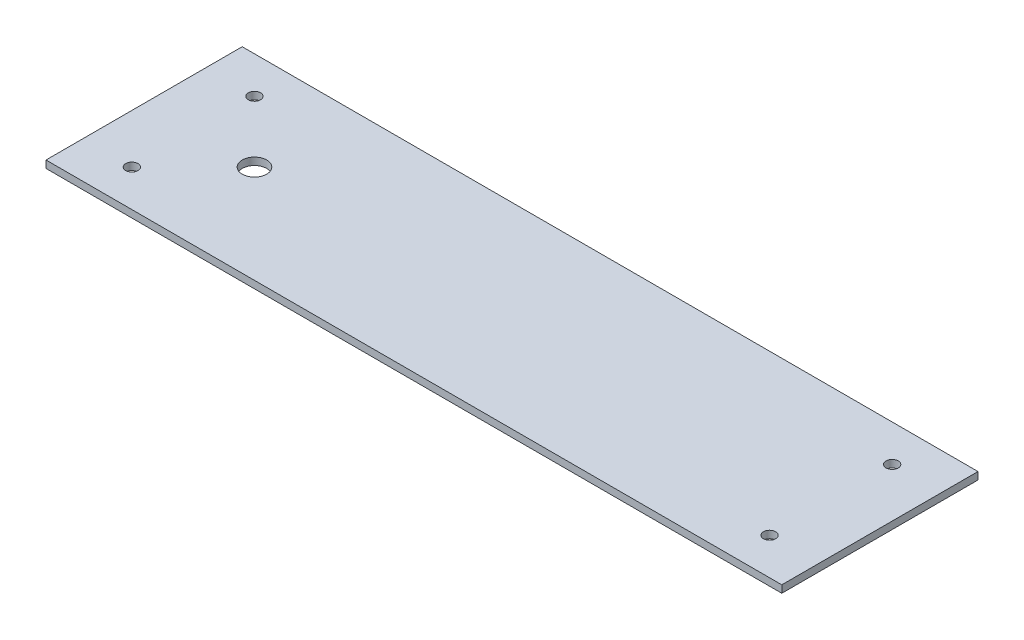
ISO-10303-21;
HEADER;
FILE_DESCRIPTION(('STEP AP214'),'2;1');
FILE_NAME('part.step','',(''),(''),'','','');
FILE_SCHEMA(('AUTOMOTIVE_DESIGN { 1 0 10303 214 1 1 1 1 }'));
ENDSEC;
DATA;
#1=APPLICATION_CONTEXT('core data for automotive mechanical design processes');
#2=APPLICATION_PROTOCOL_DEFINITION('international standard','automotive_design',2000,#1);
#3=PRODUCT_CONTEXT('',#1,'mechanical');
#4=PRODUCT('Part','Part','',(#3));
#5=PRODUCT_RELATED_PRODUCT_CATEGORY('part','',(#4));
#6=PRODUCT_DEFINITION_FORMATION('','',#4);
#7=PRODUCT_DEFINITION_CONTEXT('part definition',#1,'design');
#8=PRODUCT_DEFINITION('design','',#6,#7);
#9=PRODUCT_DEFINITION_SHAPE('','',#8);
#10=(LENGTH_UNIT() NAMED_UNIT(*) SI_UNIT(.MILLI.,.METRE.));
#11=(NAMED_UNIT(*) PLANE_ANGLE_UNIT() SI_UNIT($,.RADIAN.));
#12=(NAMED_UNIT(*) SI_UNIT($,.STERADIAN.) SOLID_ANGLE_UNIT());
#13=UNCERTAINTY_MEASURE_WITH_UNIT(LENGTH_MEASURE(1.E-05),#10,'distance_accuracy_value','');
#14=(GEOMETRIC_REPRESENTATION_CONTEXT(3) GLOBAL_UNCERTAINTY_ASSIGNED_CONTEXT((#13)) GLOBAL_UNIT_ASSIGNED_CONTEXT((#10,
#11,#12)) REPRESENTATION_CONTEXT('',''));
#15=CARTESIAN_POINT('',(0.,0.,0.));
#16=DIRECTION('',(0.,0.,1.));
#17=DIRECTION('',(1.,0.,0.));
#18=AXIS2_PLACEMENT_3D('',#15,#16,#17);
#19=CARTESIAN_POINT('',(0.,3.,0.));
#20=DIRECTION('',(0.,1.,0.));
#21=DIRECTION('',(0.,0.,1.));
#22=AXIS2_PLACEMENT_3D('',#19,#20,#21);
#23=PLANE('',#22);
#24=CARTESIAN_POINT('',(129.720603623045,3.,25.312194143202));
#25=DIRECTION('',(0.,1.,0.));
#26=DIRECTION('',(0.,0.,1.));
#27=AXIS2_PLACEMENT_3D('',#24,#25,#26);
#28=CIRCLE('',#27,2.5);
#29=CARTESIAN_POINT('',(129.720603623045,3.,27.812194143202));
#30=VERTEX_POINT('',#29);
#31=EDGE_CURVE('E127',#30,#30,#28,.T.);
#32=ORIENTED_EDGE('',*,*,#31,.F.);
#33=EDGE_LOOP('',(#32));
#34=FACE_BOUND('',#33,.T.);
#35=CARTESIAN_POINT('',(-130.279396376955,3.,25.312194143202));
#36=DIRECTION('',(0.,1.,0.));
#37=DIRECTION('',(0.,0.,1.));
#38=AXIS2_PLACEMENT_3D('',#35,#36,#37);
#39=CIRCLE('',#38,2.5);
#40=CARTESIAN_POINT('',(-130.279396376955,3.,27.812194143202));
#41=VERTEX_POINT('',#40);
#42=EDGE_CURVE('E115',#41,#41,#39,.T.);
#43=ORIENTED_EDGE('',*,*,#42,.F.);
#44=EDGE_LOOP('',(#43));
#45=FACE_BOUND('',#44,.T.);
#46=DIRECTION('',(0.,0.,1.));
#47=VECTOR('',#46,1.);
#48=CARTESIAN_POINT('',(-150.279396376955,3.,-39.687805856798));
#49=LINE('',#48,#47);
#50=CARTESIAN_POINT('',(-150.279396376955,3.,-39.687805856798));
#51=VERTEX_POINT('',#50);
#52=CARTESIAN_POINT('',(-150.279396376955,3.,40.312194143202));
#53=VERTEX_POINT('',#52);
#54=EDGE_CURVE('E85',#51,#53,#49,.T.);
#55=ORIENTED_EDGE('',*,*,#54,.T.);
#56=DIRECTION('',(1.,0.,0.));
#57=VECTOR('',#56,1.);
#58=CARTESIAN_POINT('',(-150.279396376955,3.,40.312194143202));
#59=LINE('',#58,#57);
#60=CARTESIAN_POINT('',(149.720603623045,3.,40.312194143202));
#61=VERTEX_POINT('',#60);
#62=EDGE_CURVE('E80',#53,#61,#59,.T.);
#63=ORIENTED_EDGE('',*,*,#62,.T.);
#64=DIRECTION('',(0.,0.,-1.));
#65=VECTOR('',#64,1.);
#66=CARTESIAN_POINT('',(149.720603623045,3.,-39.687805856798));
#67=LINE('',#66,#65);
#68=CARTESIAN_POINT('',(149.720603623045,3.,-39.687805856798));
#69=VERTEX_POINT('',#68);
#70=EDGE_CURVE('E83',#61,#69,#67,.T.);
#71=ORIENTED_EDGE('',*,*,#70,.T.);
#72=DIRECTION('',(-1.,0.,0.));
#73=VECTOR('',#72,1.);
#74=CARTESIAN_POINT('',(-150.279396376955,3.,-39.687805856798));
#75=LINE('',#74,#73);
#76=EDGE_CURVE('E50',#69,#51,#75,.T.);
#77=ORIENTED_EDGE('',*,*,#76,.T.);
#78=EDGE_LOOP('',(#55,#63,#71,#77));
#79=FACE_BOUND('',#78,.T.);
#80=CARTESIAN_POINT('',(-130.279396376955,3.,-24.687805856798));
#81=DIRECTION('',(0.,1.,0.));
#82=DIRECTION('',(0.,0.,1.));
#83=AXIS2_PLACEMENT_3D('',#80,#81,#82);
#84=CIRCLE('',#83,2.5);
#85=CARTESIAN_POINT('',(-130.279396376955,3.,-22.187805856798));
#86=VERTEX_POINT('',#85);
#87=EDGE_CURVE('E100',#86,#86,#84,.T.);
#88=ORIENTED_EDGE('',*,*,#87,.F.);
#89=EDGE_LOOP('',(#88));
#90=FACE_BOUND('',#89,.T.);
#91=CARTESIAN_POINT('',(129.720603623045,3.,-24.687805856798));
#92=DIRECTION('',(0.,1.,0.));
#93=DIRECTION('',(0.,0.,1.));
#94=AXIS2_PLACEMENT_3D('',#91,#92,#93);
#95=CIRCLE('',#94,2.5);
#96=CARTESIAN_POINT('',(129.720603623045,3.,-22.187805856798));
#97=VERTEX_POINT('',#96);
#98=EDGE_CURVE('E121',#97,#97,#95,.T.);
#99=ORIENTED_EDGE('',*,*,#98,.F.);
#100=EDGE_LOOP('',(#99));
#101=FACE_BOUND('',#100,.T.);
#102=CARTESIAN_POINT('',(-105.279396376955,3.,0.312194143202014));
#103=DIRECTION('',(0.,1.,0.));
#104=DIRECTION('',(0.,0.,1.));
#105=AXIS2_PLACEMENT_3D('',#102,#103,#104);
#106=CIRCLE('',#105,5.);
#107=CARTESIAN_POINT('',(-105.279396376955,3.,5.31219414320202));
#108=VERTEX_POINT('',#107);
#109=EDGE_CURVE('E133',#108,#108,#106,.T.);
#110=ORIENTED_EDGE('',*,*,#109,.F.);
#111=EDGE_LOOP('',(#110));
#112=FACE_BOUND('',#111,.T.);
#113=ADVANCED_FACE('F33',(#34,#45,#79,#90,#101,#112),#23,.T.);
#114=CARTESIAN_POINT('',(0.,0.,0.));
#115=DIRECTION('',(0.,1.,0.));
#116=DIRECTION('',(0.,0.,1.));
#117=AXIS2_PLACEMENT_3D('',#114,#115,#116);
#118=PLANE('',#117);
#119=CARTESIAN_POINT('',(129.720603623045,0.,25.312194143202));
#120=DIRECTION('',(0.,1.,0.));
#121=DIRECTION('',(0.,0.,1.));
#122=AXIS2_PLACEMENT_3D('',#119,#120,#121);
#123=CIRCLE('',#122,2.5);
#124=CARTESIAN_POINT('',(129.720603623045,0.,27.812194143202));
#125=VERTEX_POINT('',#124);
#126=EDGE_CURVE('E130',#125,#125,#123,.T.);
#127=ORIENTED_EDGE('',*,*,#126,.T.);
#128=EDGE_LOOP('',(#127));
#129=FACE_BOUND('',#128,.T.);
#130=CARTESIAN_POINT('',(-130.279396376955,0.,25.312194143202));
#131=DIRECTION('',(0.,1.,0.));
#132=DIRECTION('',(0.,0.,1.));
#133=AXIS2_PLACEMENT_3D('',#130,#131,#132);
#134=CIRCLE('',#133,2.5);
#135=CARTESIAN_POINT('',(-130.279396376955,0.,27.812194143202));
#136=VERTEX_POINT('',#135);
#137=EDGE_CURVE('E118',#136,#136,#134,.T.);
#138=ORIENTED_EDGE('',*,*,#137,.T.);
#139=EDGE_LOOP('',(#138));
#140=FACE_BOUND('',#139,.T.);
#141=DIRECTION('',(0.,0.,1.));
#142=VECTOR('',#141,1.);
#143=CARTESIAN_POINT('',(-150.279396376955,0.,-39.687805856798));
#144=LINE('',#143,#142);
#145=CARTESIAN_POINT('',(-150.279396376955,0.,-39.687805856798));
#146=VERTEX_POINT('',#145);
#147=CARTESIAN_POINT('',(-150.279396376955,0.,40.312194143202));
#148=VERTEX_POINT('',#147);
#149=EDGE_CURVE('E97',#146,#148,#144,.T.);
#150=ORIENTED_EDGE('',*,*,#149,.F.);
#151=DIRECTION('',(-1.,0.,0.));
#152=VECTOR('',#151,1.);
#153=CARTESIAN_POINT('',(-150.279396376955,0.,-39.687805856798));
#154=LINE('',#153,#152);
#155=CARTESIAN_POINT('',(149.720603623045,0.,-39.687805856798));
#156=VERTEX_POINT('',#155);
#157=EDGE_CURVE('E73',#156,#146,#154,.T.);
#158=ORIENTED_EDGE('',*,*,#157,.F.);
#159=DIRECTION('',(0.,0.,-1.));
#160=VECTOR('',#159,1.);
#161=CARTESIAN_POINT('',(149.720603623045,0.,-39.687805856798));
#162=LINE('',#161,#160);
#163=CARTESIAN_POINT('',(149.720603623045,0.,40.312194143202));
#164=VERTEX_POINT('',#163);
#165=EDGE_CURVE('E67',#164,#156,#162,.T.);
#166=ORIENTED_EDGE('',*,*,#165,.F.);
#167=DIRECTION('',(1.,0.,0.));
#168=VECTOR('',#167,1.);
#169=CARTESIAN_POINT('',(-150.279396376955,0.,40.312194143202));
#170=LINE('',#169,#168);
#171=EDGE_CURVE('E89',#148,#164,#170,.T.);
#172=ORIENTED_EDGE('',*,*,#171,.F.);
#173=EDGE_LOOP('',(#150,#158,#166,#172));
#174=FACE_BOUND('',#173,.T.);
#175=CARTESIAN_POINT('',(-130.279396376955,0.,-24.687805856798));
#176=DIRECTION('',(0.,1.,0.));
#177=DIRECTION('',(0.,0.,1.));
#178=AXIS2_PLACEMENT_3D('',#175,#176,#177);
#179=CIRCLE('',#178,2.5);
#180=CARTESIAN_POINT('',(-130.279396376955,0.,-22.187805856798));
#181=VERTEX_POINT('',#180);
#182=EDGE_CURVE('E112',#181,#181,#179,.T.);
#183=ORIENTED_EDGE('',*,*,#182,.T.);
#184=EDGE_LOOP('',(#183));
#185=FACE_BOUND('',#184,.T.);
#186=CARTESIAN_POINT('',(129.720603623045,0.,-24.687805856798));
#187=DIRECTION('',(0.,1.,0.));
#188=DIRECTION('',(0.,0.,1.));
#189=AXIS2_PLACEMENT_3D('',#186,#187,#188);
#190=CIRCLE('',#189,2.5);
#191=CARTESIAN_POINT('',(129.720603623045,0.,-22.187805856798));
#192=VERTEX_POINT('',#191);
#193=EDGE_CURVE('E124',#192,#192,#190,.T.);
#194=ORIENTED_EDGE('',*,*,#193,.T.);
#195=EDGE_LOOP('',(#194));
#196=FACE_BOUND('',#195,.T.);
#197=CARTESIAN_POINT('',(-105.279396376955,0.,0.312194143202014));
#198=DIRECTION('',(0.,1.,0.));
#199=DIRECTION('',(0.,0.,1.));
#200=AXIS2_PLACEMENT_3D('',#197,#198,#199);
#201=CIRCLE('',#200,5.);
#202=CARTESIAN_POINT('',(-105.279396376955,0.,5.31219414320202));
#203=VERTEX_POINT('',#202);
#204=EDGE_CURVE('E136',#203,#203,#201,.T.);
#205=ORIENTED_EDGE('',*,*,#204,.T.);
#206=EDGE_LOOP('',(#205));
#207=FACE_BOUND('',#206,.T.);
#208=ADVANCED_FACE('F108',(#129,#140,#174,#185,#196,#207),#118,.F.);
#209=CARTESIAN_POINT('',(-150.279396376955,3.,-39.687805856798));
#210=DIRECTION('',(1.,0.,0.));
#211=DIRECTION('',(0.,0.,-1.));
#212=AXIS2_PLACEMENT_3D('',#209,#210,#211);
#213=PLANE('',#212);
#214=ORIENTED_EDGE('',*,*,#149,.T.);
#215=DIRECTION('',(0.,-1.,0.));
#216=VECTOR('',#215,1.);
#217=CARTESIAN_POINT('',(-150.279396376955,3.,40.312194143202));
#218=LINE('',#217,#216);
#219=EDGE_CURVE('E11',#53,#148,#218,.T.);
#220=ORIENTED_EDGE('',*,*,#219,.F.);
#221=ORIENTED_EDGE('',*,*,#54,.F.);
#222=DIRECTION('',(0.,-1.,0.));
#223=VECTOR('',#222,1.);
#224=CARTESIAN_POINT('',(-150.279396376955,3.,-39.687805856798));
#225=LINE('',#224,#223);
#226=EDGE_CURVE('E93',#51,#146,#225,.T.);
#227=ORIENTED_EDGE('',*,*,#226,.T.);
#228=EDGE_LOOP('',(#214,#220,#221,#227));
#229=FACE_BOUND('',#228,.T.);
#230=ADVANCED_FACE('F35',(#229),#213,.F.);
#231=CARTESIAN_POINT('',(-150.279396376955,3.,40.312194143202));
#232=DIRECTION('',(0.,0.,-1.));
#233=DIRECTION('',(-1.,0.,0.));
#234=AXIS2_PLACEMENT_3D('',#231,#232,#233);
#235=PLANE('',#234);
#236=ORIENTED_EDGE('',*,*,#171,.T.);
#237=DIRECTION('',(0.,-1.,0.));
#238=VECTOR('',#237,1.);
#239=CARTESIAN_POINT('',(149.720603623045,3.,40.312194143202));
#240=LINE('',#239,#238);
#241=EDGE_CURVE('E42',#61,#164,#240,.T.);
#242=ORIENTED_EDGE('',*,*,#241,.F.);
#243=ORIENTED_EDGE('',*,*,#62,.F.);
#244=ORIENTED_EDGE('',*,*,#219,.T.);
#245=EDGE_LOOP('',(#236,#242,#243,#244));
#246=FACE_BOUND('',#245,.T.);
#247=ADVANCED_FACE('F88',(#246),#235,.F.);
#248=CARTESIAN_POINT('',(149.720603623045,3.,-39.687805856798));
#249=DIRECTION('',(-1.,0.,0.));
#250=DIRECTION('',(0.,0.,1.));
#251=AXIS2_PLACEMENT_3D('',#248,#249,#250);
#252=PLANE('',#251);
#253=ORIENTED_EDGE('',*,*,#165,.T.);
#254=DIRECTION('',(0.,-1.,0.));
#255=VECTOR('',#254,1.);
#256=CARTESIAN_POINT('',(149.720603623045,3.,-39.687805856798));
#257=LINE('',#256,#255);
#258=EDGE_CURVE('E90',#69,#156,#257,.T.);
#259=ORIENTED_EDGE('',*,*,#258,.F.);
#260=ORIENTED_EDGE('',*,*,#70,.F.);
#261=ORIENTED_EDGE('',*,*,#241,.T.);
#262=EDGE_LOOP('',(#253,#259,#260,#261));
#263=FACE_BOUND('',#262,.T.);
#264=ADVANCED_FACE('F91',(#263),#252,.F.);
#265=CARTESIAN_POINT('',(-150.279396376955,3.,-39.687805856798));
#266=DIRECTION('',(0.,0.,1.));
#267=DIRECTION('',(1.,0.,0.));
#268=AXIS2_PLACEMENT_3D('',#265,#266,#267);
#269=PLANE('',#268);
#270=ORIENTED_EDGE('',*,*,#157,.T.);
#271=ORIENTED_EDGE('',*,*,#226,.F.);
#272=ORIENTED_EDGE('',*,*,#76,.F.);
#273=ORIENTED_EDGE('',*,*,#258,.T.);
#274=EDGE_LOOP('',(#270,#271,#272,#273));
#275=FACE_BOUND('',#274,.T.);
#276=ADVANCED_FACE('F105',(#275),#269,.F.);
#277=CARTESIAN_POINT('',(-130.279396376955,3.,-24.687805856798));
#278=DIRECTION('',(0.,-1.,0.));
#279=DIRECTION('',(0.,0.,-1.));
#280=AXIS2_PLACEMENT_3D('',#277,#278,#279);
#281=CYLINDRICAL_SURFACE('',#280,2.5);
#282=ORIENTED_EDGE('',*,*,#87,.T.);
#283=EDGE_LOOP('',(#282));
#284=FACE_BOUND('',#283,.T.);
#285=ORIENTED_EDGE('',*,*,#182,.F.);
#286=EDGE_LOOP('',(#285));
#287=FACE_BOUND('',#286,.T.);
#288=ADVANCED_FACE('F156',(#284,#287),#281,.F.);
#289=CARTESIAN_POINT('',(-130.279396376955,3.,25.312194143202));
#290=DIRECTION('',(0.,-1.,0.));
#291=DIRECTION('',(0.,0.,-1.));
#292=AXIS2_PLACEMENT_3D('',#289,#290,#291);
#293=CYLINDRICAL_SURFACE('',#292,2.5);
#294=ORIENTED_EDGE('',*,*,#42,.T.);
#295=EDGE_LOOP('',(#294));
#296=FACE_BOUND('',#295,.T.);
#297=ORIENTED_EDGE('',*,*,#137,.F.);
#298=EDGE_LOOP('',(#297));
#299=FACE_BOUND('',#298,.T.);
#300=ADVANCED_FACE('F202',(#296,#299),#293,.F.);
#301=CARTESIAN_POINT('',(129.720603623045,3.,-24.687805856798));
#302=DIRECTION('',(0.,-1.,0.));
#303=DIRECTION('',(0.,0.,-1.));
#304=AXIS2_PLACEMENT_3D('',#301,#302,#303);
#305=CYLINDRICAL_SURFACE('',#304,2.5);
#306=ORIENTED_EDGE('',*,*,#98,.T.);
#307=EDGE_LOOP('',(#306));
#308=FACE_BOUND('',#307,.T.);
#309=ORIENTED_EDGE('',*,*,#193,.F.);
#310=EDGE_LOOP('',(#309));
#311=FACE_BOUND('',#310,.T.);
#312=ADVANCED_FACE('F210',(#308,#311),#305,.F.);
#313=CARTESIAN_POINT('',(129.720603623045,3.,25.312194143202));
#314=DIRECTION('',(0.,-1.,0.));
#315=DIRECTION('',(0.,0.,-1.));
#316=AXIS2_PLACEMENT_3D('',#313,#314,#315);
#317=CYLINDRICAL_SURFACE('',#316,2.5);
#318=ORIENTED_EDGE('',*,*,#31,.T.);
#319=EDGE_LOOP('',(#318));
#320=FACE_BOUND('',#319,.T.);
#321=ORIENTED_EDGE('',*,*,#126,.F.);
#322=EDGE_LOOP('',(#321));
#323=FACE_BOUND('',#322,.T.);
#324=ADVANCED_FACE('F218',(#320,#323),#317,.F.);
#325=CARTESIAN_POINT('',(-105.279396376955,3.,0.312194143202014));
#326=DIRECTION('',(0.,-1.,0.));
#327=DIRECTION('',(0.,0.,-1.));
#328=AXIS2_PLACEMENT_3D('',#325,#326,#327);
#329=CYLINDRICAL_SURFACE('',#328,5.);
#330=ORIENTED_EDGE('',*,*,#109,.T.);
#331=EDGE_LOOP('',(#330));
#332=FACE_BOUND('',#331,.T.);
#333=ORIENTED_EDGE('',*,*,#204,.F.);
#334=EDGE_LOOP('',(#333));
#335=FACE_BOUND('',#334,.T.);
#336=ADVANCED_FACE('F142',(#332,#335),#329,.F.);
#337=CLOSED_SHELL('',(#113,#208,#230,#247,#264,#276,#288,#300,#312,#324,#336));
#338=MANIFOLD_SOLID_BREP('B2',#337);
#339=ADVANCED_BREP_SHAPE_REPRESENTATION('',(#18,#338),#14);
#340=SHAPE_DEFINITION_REPRESENTATION(#9,#339);
ENDSEC;
END-ISO-10303-21;
